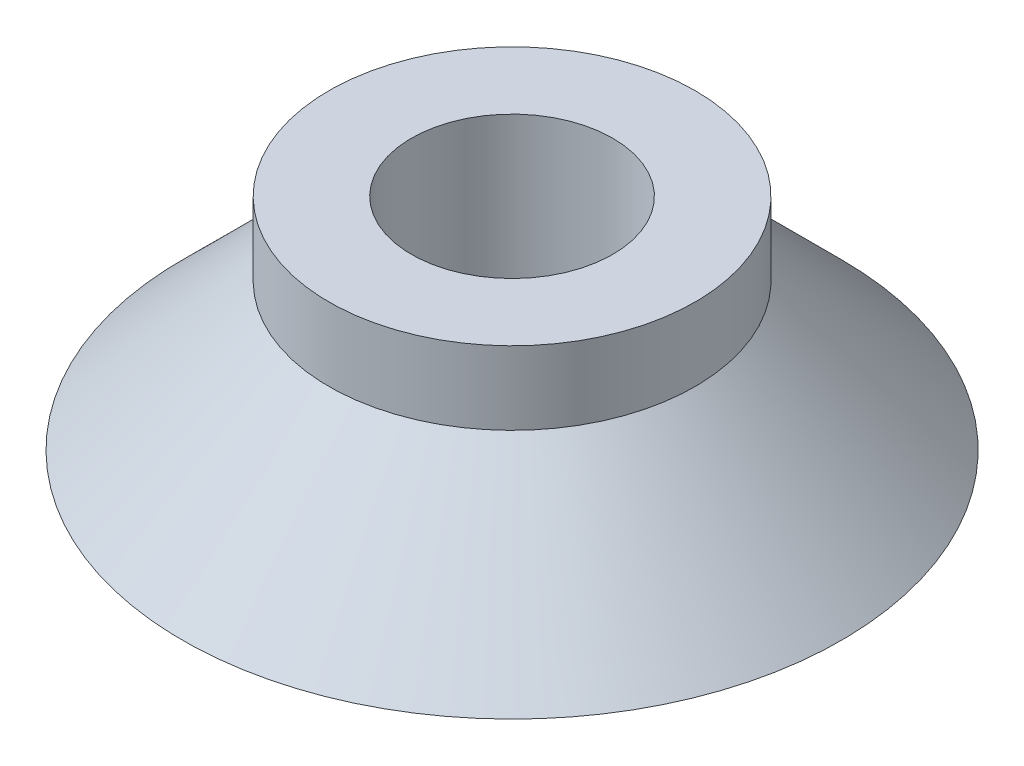
ISO-10303-21;
HEADER;
FILE_DESCRIPTION(('STEP AP214'),'2;1');
FILE_NAME('part.step','',(''),(''),'','','');
FILE_SCHEMA(('AUTOMOTIVE_DESIGN { 1 0 10303 214 1 1 1 1 }'));
ENDSEC;
DATA;
#1=APPLICATION_CONTEXT('core data for automotive mechanical design processes');
#2=APPLICATION_PROTOCOL_DEFINITION('international standard','automotive_design',2000,#1);
#3=PRODUCT_CONTEXT('',#1,'mechanical');
#4=PRODUCT('Part','Part','',(#3));
#5=PRODUCT_RELATED_PRODUCT_CATEGORY('part','',(#4));
#6=PRODUCT_DEFINITION_FORMATION('','',#4);
#7=PRODUCT_DEFINITION_CONTEXT('part definition',#1,'design');
#8=PRODUCT_DEFINITION('design','',#6,#7);
#9=PRODUCT_DEFINITION_SHAPE('','',#8);
#10=(LENGTH_UNIT() NAMED_UNIT(*) SI_UNIT(.MILLI.,.METRE.));
#11=(NAMED_UNIT(*) PLANE_ANGLE_UNIT() SI_UNIT($,.RADIAN.));
#12=(NAMED_UNIT(*) SI_UNIT($,.STERADIAN.) SOLID_ANGLE_UNIT());
#13=UNCERTAINTY_MEASURE_WITH_UNIT(LENGTH_MEASURE(1.E-05),#10,'distance_accuracy_value','');
#14=(GEOMETRIC_REPRESENTATION_CONTEXT(3) GLOBAL_UNCERTAINTY_ASSIGNED_CONTEXT((#13)) GLOBAL_UNIT_ASSIGNED_CONTEXT((#10,
#11,#12)) REPRESENTATION_CONTEXT('',''));
#15=CARTESIAN_POINT('',(0.,0.,0.));
#16=DIRECTION('',(0.,0.,1.));
#17=DIRECTION('',(1.,0.,0.));
#18=AXIS2_PLACEMENT_3D('',#15,#16,#17);
#19=CARTESIAN_POINT('',(0.,6.,0.));
#20=DIRECTION('',(0.,-1.,0.));
#21=DIRECTION('',(0.,0.,-1.));
#22=AXIS2_PLACEMENT_3D('',#19,#20,#21);
#23=PLANE('',#22);
#24=CARTESIAN_POINT('',(0.,6.,0.));
#25=DIRECTION('',(0.,-1.,0.));
#26=DIRECTION('',(0.,0.,-1.));
#27=AXIS2_PLACEMENT_3D('',#24,#25,#26);
#28=CIRCLE('',#27,5.);
#29=CARTESIAN_POINT('',(0.,6.,-5.));
#30=VERTEX_POINT('',#29);
#31=EDGE_CURVE('E53',#30,#30,#28,.T.);
#32=ORIENTED_EDGE('',*,*,#31,.F.);
#33=EDGE_LOOP('',(#32));
#34=FACE_BOUND('',#33,.T.);
#35=CARTESIAN_POINT('',(0.,6.,0.));
#36=DIRECTION('',(0.,-1.,0.));
#37=DIRECTION('',(0.,0.,-1.));
#38=AXIS2_PLACEMENT_3D('',#35,#36,#37);
#39=CIRCLE('',#38,2.75);
#40=CARTESIAN_POINT('',(0.,6.,-2.75));
#41=VERTEX_POINT('',#40);
#42=EDGE_CURVE('E10',#41,#41,#39,.T.);
#43=ORIENTED_EDGE('',*,*,#42,.T.);
#44=EDGE_LOOP('',(#43));
#45=FACE_BOUND('',#44,.T.);
#46=ADVANCED_FACE('F34',(#34,#45),#23,.F.);
#47=CARTESIAN_POINT('',(0.,0.,0.));
#48=DIRECTION('',(0.,-1.,0.));
#49=DIRECTION('',(0.,0.,-1.));
#50=AXIS2_PLACEMENT_3D('',#47,#48,#49);
#51=CYLINDRICAL_SURFACE('',#50,2.75);
#52=CARTESIAN_POINT('',(0.,0.,0.));
#53=DIRECTION('',(0.,-1.,0.));
#54=DIRECTION('',(0.,0.,-1.));
#55=AXIS2_PLACEMENT_3D('',#52,#53,#54);
#56=CIRCLE('',#55,2.75);
#57=CARTESIAN_POINT('',(0.,0.,-2.75));
#58=VERTEX_POINT('',#57);
#59=EDGE_CURVE('E40',#58,#58,#56,.T.);
#60=ORIENTED_EDGE('',*,*,#59,.T.);
#61=EDGE_LOOP('',(#60));
#62=FACE_BOUND('',#61,.T.);
#63=ORIENTED_EDGE('',*,*,#42,.F.);
#64=EDGE_LOOP('',(#63));
#65=FACE_BOUND('',#64,.T.);
#66=ADVANCED_FACE('F61',(#62,#65),#51,.F.);
#67=CARTESIAN_POINT('',(0.,0.,0.));
#68=DIRECTION('',(0.,-1.,0.));
#69=DIRECTION('',(0.,0.,-1.));
#70=AXIS2_PLACEMENT_3D('',#67,#68,#69);
#71=PLANE('',#70);
#72=CARTESIAN_POINT('',(0.,0.,0.));
#73=DIRECTION('',(0.,-1.,0.));
#74=DIRECTION('',(0.,0.,-1.));
#75=AXIS2_PLACEMENT_3D('',#72,#73,#74);
#76=CIRCLE('',#75,9.00000000000004);
#77=CARTESIAN_POINT('',(0.,0.,-9.00000000000004));
#78=VERTEX_POINT('',#77);
#79=EDGE_CURVE('E44',#78,#78,#76,.T.);
#80=ORIENTED_EDGE('',*,*,#79,.T.);
#81=EDGE_LOOP('',(#80));
#82=FACE_BOUND('',#81,.T.);
#83=ORIENTED_EDGE('',*,*,#59,.F.);
#84=EDGE_LOOP('',(#83));
#85=FACE_BOUND('',#84,.T.);
#86=ADVANCED_FACE('F65',(#82,#85),#71,.T.);
#87=CARTESIAN_POINT('',(0.,4.,0.));
#88=DIRECTION('',(0.,-1.,0.));
#89=DIRECTION('',(0.,0.,-1.));
#90=AXIS2_PLACEMENT_3D('',#87,#88,#89);
#91=CONICAL_SURFACE('',#90,5.,0.785398163397454);
#92=ORIENTED_EDGE('',*,*,#79,.F.);
#93=EDGE_LOOP('',(#92));
#94=FACE_BOUND('',#93,.T.);
#95=CARTESIAN_POINT('',(0.,4.,0.));
#96=DIRECTION('',(0.,-1.,0.));
#97=DIRECTION('',(0.,0.,-1.));
#98=AXIS2_PLACEMENT_3D('',#95,#96,#97);
#99=CIRCLE('',#98,5.);
#100=CARTESIAN_POINT('',(0.,4.,-5.));
#101=VERTEX_POINT('',#100);
#102=EDGE_CURVE('E48',#101,#101,#99,.T.);
#103=ORIENTED_EDGE('',*,*,#102,.T.);
#104=EDGE_LOOP('',(#103));
#105=FACE_BOUND('',#104,.T.);
#106=ADVANCED_FACE('F69',(#94,#105),#91,.T.);
#107=CARTESIAN_POINT('',(0.,0.,0.));
#108=DIRECTION('',(0.,-1.,0.));
#109=DIRECTION('',(0.,0.,-1.));
#110=AXIS2_PLACEMENT_3D('',#107,#108,#109);
#111=CYLINDRICAL_SURFACE('',#110,5.);
#112=ORIENTED_EDGE('',*,*,#31,.T.);
#113=EDGE_LOOP('',(#112));
#114=FACE_BOUND('',#113,.T.);
#115=ORIENTED_EDGE('',*,*,#102,.F.);
#116=EDGE_LOOP('',(#115));
#117=FACE_BOUND('',#116,.T.);
#118=ADVANCED_FACE('F57',(#114,#117),#111,.T.);
#119=CLOSED_SHELL('',(#46,#66,#86,#106,#118));
#120=MANIFOLD_SOLID_BREP('B2',#119);
#121=ADVANCED_BREP_SHAPE_REPRESENTATION('',(#18,#120),#14);
#122=SHAPE_DEFINITION_REPRESENTATION(#9,#121);
ENDSEC;
END-ISO-10303-21;
